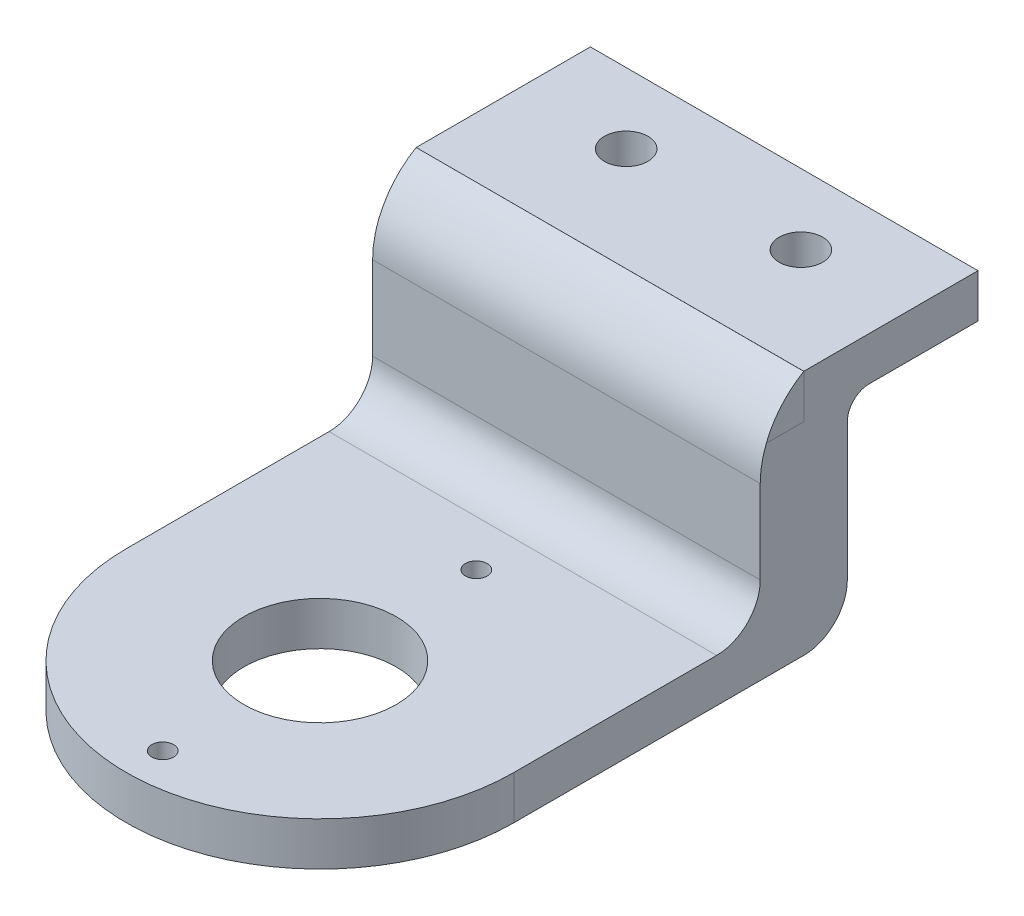
ISO-10303-21;
HEADER;
FILE_DESCRIPTION(('STEP AP214'),'2;1');
FILE_NAME('part.step','',(''),(''),'','','');
FILE_SCHEMA(('AUTOMOTIVE_DESIGN { 1 0 10303 214 1 1 1 1 }'));
ENDSEC;
DATA;
#1=APPLICATION_CONTEXT('core data for automotive mechanical design processes');
#2=APPLICATION_PROTOCOL_DEFINITION('international standard','automotive_design',2000,#1);
#3=PRODUCT_CONTEXT('',#1,'mechanical');
#4=PRODUCT('Part','Part','',(#3));
#5=PRODUCT_RELATED_PRODUCT_CATEGORY('part','',(#4));
#6=PRODUCT_DEFINITION_FORMATION('','',#4);
#7=PRODUCT_DEFINITION_CONTEXT('part definition',#1,'design');
#8=PRODUCT_DEFINITION('design','',#6,#7);
#9=PRODUCT_DEFINITION_SHAPE('','',#8);
#10=(LENGTH_UNIT() NAMED_UNIT(*) SI_UNIT(.MILLI.,.METRE.));
#11=(NAMED_UNIT(*) PLANE_ANGLE_UNIT() SI_UNIT($,.RADIAN.));
#12=(NAMED_UNIT(*) SI_UNIT($,.STERADIAN.) SOLID_ANGLE_UNIT());
#13=UNCERTAINTY_MEASURE_WITH_UNIT(LENGTH_MEASURE(1.E-05),#10,'distance_accuracy_value','');
#14=(GEOMETRIC_REPRESENTATION_CONTEXT(3) GLOBAL_UNCERTAINTY_ASSIGNED_CONTEXT((#13)) GLOBAL_UNIT_ASSIGNED_CONTEXT((#10,
#11,#12)) REPRESENTATION_CONTEXT('',''));
#15=CARTESIAN_POINT('',(0.,0.,0.));
#16=DIRECTION('',(0.,0.,1.));
#17=DIRECTION('',(1.,0.,0.));
#18=AXIS2_PLACEMENT_3D('',#15,#16,#17);
#19=CARTESIAN_POINT('',(8.925,-14.,-26.4139671971717));
#20=DIRECTION('',(0.,0.,1.));
#21=DIRECTION('',(1.,0.,0.));
#22=AXIS2_PLACEMENT_3D('',#19,#20,#21);
#23=PLANE('',#22);
#24=DIRECTION('',(-0.000175443126578921,-0.999999984609855,0.));
#25=VECTOR('',#24,1.);
#26=CARTESIAN_POINT('',(-8.87464911374685,-14.0000000307803,-26.4139671971717));
#27=LINE('',#26,#25);
#28=CARTESIAN_POINT('',(-8.87464911374685,-14.0000000307803,-26.4139671971717));
#29=VERTEX_POINT('',#28);
#30=CARTESIAN_POINT('',(-8.875,-16.,-26.4139671971717));
#31=VERTEX_POINT('',#30);
#32=EDGE_CURVE('E138',#29,#31,#27,.T.);
#33=ORIENTED_EDGE('',*,*,#32,.F.);
#34=DIRECTION('',(-1.,0.,0.));
#35=VECTOR('',#34,1.);
#36=CARTESIAN_POINT('',(8.925,-14.,-26.4139671971717));
#37=LINE('',#36,#35);
#38=CARTESIAN_POINT('',(-8.875,-14.,-26.4139671971717));
#39=VERTEX_POINT('',#38);
#40=EDGE_CURVE('E317',#29,#39,#37,.T.);
#41=ORIENTED_EDGE('',*,*,#40,.T.);
#42=DIRECTION('',(0.,-1.,0.));
#43=VECTOR('',#42,1.);
#44=CARTESIAN_POINT('',(-8.875,-14.,-26.4139671971717));
#45=LINE('',#44,#43);
#46=EDGE_CURVE('E326',#39,#31,#45,.T.);
#47=ORIENTED_EDGE('',*,*,#46,.T.);
#48=EDGE_LOOP('',(#33,#41,#47));
#49=FACE_BOUND('',#48,.T.);
#50=ADVANCED_FACE('F17',(#49),#23,.T.);
#51=CARTESIAN_POINT('',(0.024999999999999,-23.3,-13.1));
#52=DIRECTION('',(0.,1.,0.));
#53=DIRECTION('',(0.,0.,1.));
#54=AXIS2_PLACEMENT_3D('',#51,#52,#53);
#55=PLANE('',#54);
#56=CARTESIAN_POINT('',(0.,-23.3,-20.3));
#57=DIRECTION('',(0.,1.,0.));
#58=DIRECTION('',(0.,0.,1.));
#59=AXIS2_PLACEMENT_3D('',#56,#57,#58);
#60=CIRCLE('',#59,0.5);
#61=CARTESIAN_POINT('',(0.,-23.3,-19.8));
#62=VERTEX_POINT('',#61);
#63=EDGE_CURVE('E21',#62,#62,#60,.T.);
#64=ORIENTED_EDGE('',*,*,#63,.F.);
#65=EDGE_LOOP('',(#64));
#66=FACE_BOUND('',#65,.T.);
#67=CARTESIAN_POINT('',(0.,-23.3,-5.9));
#68=DIRECTION('',(0.,1.,0.));
#69=DIRECTION('',(0.,0.,1.));
#70=AXIS2_PLACEMENT_3D('',#67,#68,#69);
#71=CIRCLE('',#70,0.5);
#72=CARTESIAN_POINT('',(0.,-23.3,-5.4));
#73=VERTEX_POINT('',#72);
#74=EDGE_CURVE('E210',#73,#73,#71,.T.);
#75=ORIENTED_EDGE('',*,*,#74,.F.);
#76=EDGE_LOOP('',(#75));
#77=FACE_BOUND('',#76,.T.);
#78=CARTESIAN_POINT('',(0.024999999999999,-23.3,-13.1));
#79=DIRECTION('',(0.,-1.,0.));
#80=DIRECTION('',(1.,0.,0.));
#81=AXIS2_PLACEMENT_3D('',#78,#79,#80);
#82=CIRCLE('',#81,3.5);
#83=CARTESIAN_POINT('',(3.525,-23.3,-13.1));
#84=VERTEX_POINT('',#83);
#85=EDGE_CURVE('E147',#84,#84,#82,.T.);
#86=ORIENTED_EDGE('',*,*,#85,.T.);
#87=EDGE_LOOP('',(#86));
#88=FACE_BOUND('',#87,.T.);
#89=DIRECTION('',(0.,0.,-1.));
#90=VECTOR('',#89,1.);
#91=CARTESIAN_POINT('',(8.925,-23.3,-13.1));
#92=LINE('',#91,#90);
#93=CARTESIAN_POINT('',(8.925,-23.3,-13.1));
#94=VERTEX_POINT('',#93);
#95=CARTESIAN_POINT('',(8.925,-23.3,-22.4139671971717));
#96=VERTEX_POINT('',#95);
#97=EDGE_CURVE('E258',#94,#96,#92,.T.);
#98=ORIENTED_EDGE('',*,*,#97,.T.);
#99=DIRECTION('',(-1.,0.,0.));
#100=VECTOR('',#99,1.);
#101=CARTESIAN_POINT('',(0.024999999999999,-23.3,-22.4139671971717));
#102=LINE('',#101,#100);
#103=CARTESIAN_POINT('',(-8.875,-23.3,-22.4139671971717));
#104=VERTEX_POINT('',#103);
#105=EDGE_CURVE('E177',#96,#104,#102,.T.);
#106=ORIENTED_EDGE('',*,*,#105,.T.);
#107=DIRECTION('',(0.,0.,1.));
#108=VECTOR('',#107,1.);
#109=CARTESIAN_POINT('',(-8.875,-23.3,-28.4139671971717));
#110=LINE('',#109,#108);
#111=CARTESIAN_POINT('',(-8.875,-23.3,-13.1));
#112=VERTEX_POINT('',#111);
#113=EDGE_CURVE('E251',#104,#112,#110,.T.);
#114=ORIENTED_EDGE('',*,*,#113,.T.);
#115=CARTESIAN_POINT('',(0.024999999999999,-23.3,-13.1));
#116=DIRECTION('',(0.,1.,0.));
#117=DIRECTION('',(1.,0.,0.));
#118=AXIS2_PLACEMENT_3D('',#115,#116,#117);
#119=CIRCLE('',#118,8.9);
#120=EDGE_CURVE('E269',#112,#94,#119,.T.);
#121=ORIENTED_EDGE('',*,*,#120,.T.);
#122=EDGE_LOOP('',(#98,#106,#114,#121));
#123=FACE_BOUND('',#122,.T.);
#124=ADVANCED_FACE('F364',(#66,#77,#88,#123),#55,.T.);
#125=CARTESIAN_POINT('',(0.,-14.,0.));
#126=DIRECTION('',(0.,-1.,0.));
#127=DIRECTION('',(0.,0.,-1.));
#128=AXIS2_PLACEMENT_3D('',#125,#126,#127);
#129=PLANE('',#128);
#130=CARTESIAN_POINT('',(-4.,-14.,-31.1818617364617));
#131=DIRECTION('',(0.,-1.,0.));
#132=DIRECTION('',(-1.,0.,0.));
#133=AXIS2_PLACEMENT_3D('',#130,#131,#132);
#134=CIRCLE('',#133,1.);
#135=CARTESIAN_POINT('',(-5.,-14.,-31.1818617364617));
#136=VERTEX_POINT('',#135);
#137=EDGE_CURVE('E282',#136,#136,#134,.T.);
#138=ORIENTED_EDGE('',*,*,#137,.T.);
#139=EDGE_LOOP('',(#138));
#140=FACE_BOUND('',#139,.T.);
#141=DIRECTION('',(0.,0.,1.));
#142=VECTOR('',#141,1.);
#143=CARTESIAN_POINT('',(8.925,-14.,-28.4139671971717));
#144=LINE('',#143,#142);
#145=CARTESIAN_POINT('',(8.925,-14.,-34.4139671971717));
#146=VERTEX_POINT('',#145);
#147=CARTESIAN_POINT('',(8.925,-14.,-26.4139671971717));
#148=VERTEX_POINT('',#147);
#149=EDGE_CURVE('E313',#146,#148,#144,.T.);
#150=ORIENTED_EDGE('',*,*,#149,.F.);
#151=DIRECTION('',(-1.,0.,0.));
#152=VECTOR('',#151,1.);
#153=CARTESIAN_POINT('',(8.925,-14.,-34.4139671971717));
#154=LINE('',#153,#152);
#155=CARTESIAN_POINT('',(-8.875,-14.,-34.4139671971717));
#156=VERTEX_POINT('',#155);
#157=EDGE_CURVE('E291',#146,#156,#154,.T.);
#158=ORIENTED_EDGE('',*,*,#157,.T.);
#159=DIRECTION('',(0.,0.,-1.));
#160=VECTOR('',#159,1.);
#161=CARTESIAN_POINT('',(-8.875,-14.,-26.4139671971717));
#162=LINE('',#161,#160);
#163=EDGE_CURVE('E322',#39,#156,#162,.T.);
#164=ORIENTED_EDGE('',*,*,#163,.F.);
#165=ORIENTED_EDGE('',*,*,#40,.F.);
#166=EDGE_CURVE('E318',#148,#29,#37,.T.);
#167=ORIENTED_EDGE('',*,*,#166,.F.);
#168=EDGE_LOOP('',(#150,#158,#164,#165,#167));
#169=FACE_BOUND('',#168,.T.);
#170=CARTESIAN_POINT('',(4.025,-14.,-31.1818617364574));
#171=DIRECTION('',(0.,1.,0.));
#172=DIRECTION('',(-1.,0.,0.));
#173=AXIS2_PLACEMENT_3D('',#170,#171,#172);
#174=CIRCLE('',#173,1.);
#175=CARTESIAN_POINT('',(3.025,-14.,-31.1818617364574));
#176=VERTEX_POINT('',#175);
#177=EDGE_CURVE('E283',#176,#176,#174,.T.);
#178=ORIENTED_EDGE('',*,*,#177,.F.);
#179=EDGE_LOOP('',(#178));
#180=FACE_BOUND('',#179,.T.);
#181=ADVANCED_FACE('F354',(#140,#169,#180),#129,.F.);
#182=CARTESIAN_POINT('',(-8.875,-16.,-34.4139671971717));
#183=DIRECTION('',(-0.000175443126578965,-0.999999984609855,0.));
#184=DIRECTION('',(0.999999984609855,-0.000175443126578965,0.));
#185=AXIS2_PLACEMENT_3D('',#182,#183,#184);
#186=PLANE('',#185);
#187=CARTESIAN_POINT('',(-4.,-16.0008552852553,-31.1818617364617));
#188=DIRECTION('',(-0.000175443126578965,-0.999999984609855,0.));
#189=DIRECTION('',(-0.999999984609855,0.000175443126578965,0.));
#190=AXIS2_PLACEMENT_3D('',#187,#188,#189);
#191=ELLIPSE('',#190,1.00000001539015,1.);
#192=CARTESIAN_POINT('',(-5.,-16.000679842126,-31.1818617364617));
#193=VERTEX_POINT('',#192);
#194=EDGE_CURVE('E287',#193,#193,#191,.F.);
#195=ORIENTED_EDGE('',*,*,#194,.T.);
#196=EDGE_LOOP('',(#195));
#197=FACE_BOUND('',#196,.T.);
#198=DIRECTION('',(0.,0.,1.));
#199=VECTOR('',#198,1.);
#200=CARTESIAN_POINT('',(8.925,-16.0031228877011,-34.4139671971717));
#201=LINE('',#200,#199);
#202=CARTESIAN_POINT('',(8.925,-16.0031228877011,-34.4139671971717));
#203=VERTEX_POINT('',#202);
#204=CARTESIAN_POINT('',(8.925,-16.0031228877011,-29.4139671971717));
#205=VERTEX_POINT('',#204);
#206=EDGE_CURVE('E307',#203,#205,#201,.T.);
#207=ORIENTED_EDGE('',*,*,#206,.T.);
#208=DIRECTION('',(0.999999984609855,-0.000175443126578965,0.));
#209=VECTOR('',#208,1.);
#210=CARTESIAN_POINT('',(-8.875,-16.,-29.4139671971717));
#211=LINE('',#210,#209);
#212=CARTESIAN_POINT('',(-8.875,-16.,-29.4139671971717));
#213=VERTEX_POINT('',#212);
#214=EDGE_CURVE('E41',#205,#213,#211,.F.);
#215=ORIENTED_EDGE('',*,*,#214,.T.);
#216=DIRECTION('',(0.,0.,1.));
#217=VECTOR('',#216,1.);
#218=CARTESIAN_POINT('',(-8.875,-16.,-34.4139671971717));
#219=LINE('',#218,#217);
#220=CARTESIAN_POINT('',(-8.875,-16.,-34.4139671971717));
#221=VERTEX_POINT('',#220);
#222=EDGE_CURVE('E310',#221,#213,#219,.T.);
#223=ORIENTED_EDGE('',*,*,#222,.F.);
#224=DIRECTION('',(0.999999984609855,-0.000175443126578965,0.));
#225=VECTOR('',#224,1.);
#226=CARTESIAN_POINT('',(-8.875,-16.,-34.4139671971717));
#227=LINE('',#226,#225);
#228=EDGE_CURVE('E299',#221,#203,#227,.T.);
#229=ORIENTED_EDGE('',*,*,#228,.T.);
#230=EDGE_LOOP('',(#207,#215,#223,#229));
#231=FACE_BOUND('',#230,.T.);
#232=CARTESIAN_POINT('',(4.025,-16.0022632163677,-31.1818617364574));
#233=DIRECTION('',(-0.000175443126578965,-0.999999984609855,0.));
#234=DIRECTION('',(-0.999999984609855,0.000175443126578965,0.));
#235=AXIS2_PLACEMENT_3D('',#232,#233,#234);
#236=ELLIPSE('',#235,1.00000001539015,1.);
#237=CARTESIAN_POINT('',(3.025,-16.0020877732384,-31.1818617364574));
#238=VERTEX_POINT('',#237);
#239=EDGE_CURVE('E167',#238,#238,#236,.T.);
#240=ORIENTED_EDGE('',*,*,#239,.F.);
#241=EDGE_LOOP('',(#240));
#242=FACE_BOUND('',#241,.T.);
#243=ADVANCED_FACE('F351',(#197,#231,#242),#186,.T.);
#244=CARTESIAN_POINT('',(-8.875,-14.,-28.4139671971717));
#245=DIRECTION('',(0.,0.,-1.));
#246=DIRECTION('',(-1.,0.,0.));
#247=AXIS2_PLACEMENT_3D('',#244,#245,#246);
#248=PLANE('',#247);
#249=DIRECTION('',(0.,-1.,0.));
#250=VECTOR('',#249,1.);
#251=CARTESIAN_POINT('',(-8.875,-14.,-28.4139671971717));
#252=LINE('',#251,#250);
#253=CARTESIAN_POINT('',(-8.875,-23.3,-28.4139671971717));
#254=VERTEX_POINT('',#253);
#255=CARTESIAN_POINT('',(-8.875,-17.0000000153901,-28.4139671971717));
#256=VERTEX_POINT('',#255);
#257=EDGE_CURVE('E325',#254,#256,#252,.F.);
#258=ORIENTED_EDGE('',*,*,#257,.T.);
#259=DIRECTION('',(0.999999984609855,-0.000175443126578965,0.));
#260=VECTOR('',#259,1.);
#261=CARTESIAN_POINT('',(8.92482455687342,-17.003122872311,-28.4139671971717));
#262=LINE('',#261,#260);
#263=CARTESIAN_POINT('',(8.925,-17.0031229030913,-28.4139671971717));
#264=VERTEX_POINT('',#263);
#265=EDGE_CURVE('E203',#256,#264,#262,.T.);
#266=ORIENTED_EDGE('',*,*,#265,.T.);
#267=DIRECTION('',(0.,-1.,0.));
#268=VECTOR('',#267,1.);
#269=CARTESIAN_POINT('',(8.925,-14.,-28.4139671971717));
#270=LINE('',#269,#268);
#271=CARTESIAN_POINT('',(8.925,-23.3,-28.4139671971717));
#272=VERTEX_POINT('',#271);
#273=EDGE_CURVE('E165',#272,#264,#270,.F.);
#274=ORIENTED_EDGE('',*,*,#273,.F.);
#275=DIRECTION('',(-1.,0.,0.));
#276=VECTOR('',#275,1.);
#277=CARTESIAN_POINT('',(-8.875,-23.3,-28.4139671971717));
#278=LINE('',#277,#276);
#279=EDGE_CURVE('E190',#272,#254,#278,.T.);
#280=ORIENTED_EDGE('',*,*,#279,.T.);
#281=EDGE_LOOP('',(#258,#266,#274,#280));
#282=FACE_BOUND('',#281,.T.);
#283=ADVANCED_FACE('F353',(#282),#248,.T.);
#284=CARTESIAN_POINT('',(8.925,-14.,-28.4139671971717));
#285=DIRECTION('',(1.,0.,0.));
#286=DIRECTION('',(0.,0.,-1.));
#287=AXIS2_PLACEMENT_3D('',#284,#285,#286);
#288=PLANE('',#287);
#289=DIRECTION('',(0.,0.,-1.));
#290=VECTOR('',#289,1.);
#291=CARTESIAN_POINT('',(8.925,-25.3,-13.1));
#292=LINE('',#291,#290);
#293=CARTESIAN_POINT('',(8.925,-25.3,-13.1));
#294=VERTEX_POINT('',#293);
#295=CARTESIAN_POINT('',(8.925,-25.3,-26.4139671971717));
#296=VERTEX_POINT('',#295);
#297=EDGE_CURVE('E262',#294,#296,#292,.T.);
#298=ORIENTED_EDGE('',*,*,#297,.T.);
#299=CARTESIAN_POINT('',(8.925,-23.3,-26.4139671971717));
#300=DIRECTION('',(1.,0.,0.));
#301=DIRECTION('',(0.,0.,-1.));
#302=AXIS2_PLACEMENT_3D('',#299,#300,#301);
#303=CIRCLE('',#302,2.);
#304=EDGE_CURVE('E200',#296,#272,#303,.T.);
#305=ORIENTED_EDGE('',*,*,#304,.T.);
#306=ORIENTED_EDGE('',*,*,#273,.T.);
#307=CARTESIAN_POINT('',(8.925,-17.0031229030913,-29.4139671971717));
#308=DIRECTION('',(1.,0.,0.));
#309=DIRECTION('',(0.,1.,0.));
#310=AXIS2_PLACEMENT_3D('',#307,#308,#309);
#311=ELLIPSE('',#310,1.00000001539015,1.);
#312=EDGE_CURVE('E27',#264,#205,#311,.F.);
#313=ORIENTED_EDGE('',*,*,#312,.T.);
#314=ORIENTED_EDGE('',*,*,#206,.F.);
#315=DIRECTION('',(0.,1.,0.));
#316=VECTOR('',#315,1.);
#317=CARTESIAN_POINT('',(8.925,-16.0031228877011,-34.4139671971717));
#318=LINE('',#317,#316);
#319=EDGE_CURVE('E303',#203,#146,#318,.T.);
#320=ORIENTED_EDGE('',*,*,#319,.T.);
#321=ORIENTED_EDGE('',*,*,#149,.T.);
#322=DIRECTION('',(0.,-1.,0.));
#323=VECTOR('',#322,1.);
#324=CARTESIAN_POINT('',(8.925,-14.,-26.4139671971717));
#325=LINE('',#324,#323);
#326=CARTESIAN_POINT('',(8.925,-14.0031228569209,-26.4139671971717));
#327=VERTEX_POINT('',#326);
#328=EDGE_CURVE('E330',#148,#327,#325,.T.);
#329=ORIENTED_EDGE('',*,*,#328,.T.);
#330=CARTESIAN_POINT('',(8.925,-16.0031228877011,-26.4139671971717));
#331=VERTEX_POINT('',#330);
#332=EDGE_CURVE('E142',#327,#331,#325,.T.);
#333=ORIENTED_EDGE('',*,*,#332,.T.);
#334=DIRECTION('',(0.,0.,-1.));
#335=VECTOR('',#334,1.);
#336=CARTESIAN_POINT('',(8.925,-16.0031228877011,-24.4139671971717));
#337=LINE('',#336,#335);
#338=CARTESIAN_POINT('',(8.925,-16.0031228877011,-24.6915477607633));
#339=VERTEX_POINT('',#338);
#340=EDGE_CURVE('E133',#339,#331,#337,.T.);
#341=ORIENTED_EDGE('',*,*,#340,.F.);
#342=CARTESIAN_POINT('',(8.925,-17.4672245253717,-28.4139671971717));
#343=DIRECTION('',(1.,0.,0.));
#344=DIRECTION('',(0.,-1.,-2.22194794302517E-12));
#345=AXIS2_PLACEMENT_3D('',#342,#343,#344);
#346=ELLIPSE('',#345,4.00000006156058,4.);
#347=CARTESIAN_POINT('',(8.925,-17.4672245253717,-24.4139671971717));
#348=VERTEX_POINT('',#347);
#349=EDGE_CURVE('E154',#339,#348,#346,.T.);
#350=ORIENTED_EDGE('',*,*,#349,.T.);
#351=DIRECTION('',(0.,-1.,0.));
#352=VECTOR('',#351,1.);
#353=CARTESIAN_POINT('',(8.925,-16.0031228877011,-24.4139671971717));
#354=LINE('',#353,#352);
#355=CARTESIAN_POINT('',(8.925,-21.3,-24.4139671971717));
#356=VERTEX_POINT('',#355);
#357=EDGE_CURVE('E240',#348,#356,#354,.T.);
#358=ORIENTED_EDGE('',*,*,#357,.T.);
#359=CARTESIAN_POINT('',(8.925,-21.3,-22.4139671971717));
#360=DIRECTION('',(1.,0.,0.));
#361=DIRECTION('',(0.,0.,-1.));
#362=AXIS2_PLACEMENT_3D('',#359,#360,#361);
#363=CIRCLE('',#362,2.);
#364=EDGE_CURVE('E187',#356,#96,#363,.F.);
#365=ORIENTED_EDGE('',*,*,#364,.T.);
#366=ORIENTED_EDGE('',*,*,#97,.F.);
#367=DIRECTION('',(0.,1.,0.));
#368=VECTOR('',#367,1.);
#369=CARTESIAN_POINT('',(8.925,-25.3,-13.1));
#370=LINE('',#369,#368);
#371=EDGE_CURVE('E266',#294,#94,#370,.T.);
#372=ORIENTED_EDGE('',*,*,#371,.F.);
#373=EDGE_LOOP('',(#298,#305,#306,#313,#314,#320,#321,#329,#333,#341,#350,#358,#365,#366,#372));
#374=FACE_BOUND('',#373,.T.);
#375=ADVANCED_FACE('F361',(#374),#288,.T.);
#376=DIRECTION('',(-0.999999984609855,0.000175443126578965,0.));
#377=VECTOR('',#376,1.);
#378=CARTESIAN_POINT('',(8.92535088625316,-14.0031229184815,-26.4139671971717));
#379=LINE('',#378,#377);
#380=EDGE_CURVE('E149',#327,#29,#379,.T.);
#381=ORIENTED_EDGE('',*,*,#380,.F.);
#382=ORIENTED_EDGE('',*,*,#328,.F.);
#383=ORIENTED_EDGE('',*,*,#166,.T.);
#384=EDGE_LOOP('',(#381,#382,#383));
#385=FACE_BOUND('',#384,.T.);
#386=ADVANCED_FACE('F371',(#385),#23,.T.);
#387=CARTESIAN_POINT('',(-8.875,-14.,-26.4139671971717));
#388=DIRECTION('',(-1.,0.,0.));
#389=DIRECTION('',(0.,0.,1.));
#390=AXIS2_PLACEMENT_3D('',#387,#388,#389);
#391=PLANE('',#390);
#392=ORIENTED_EDGE('',*,*,#257,.F.);
#393=CARTESIAN_POINT('',(-8.875,-23.3,-26.4139671971717));
#394=DIRECTION('',(-1.,0.,0.));
#395=DIRECTION('',(0.,0.,1.));
#396=AXIS2_PLACEMENT_3D('',#393,#394,#395);
#397=CIRCLE('',#396,2.);
#398=CARTESIAN_POINT('',(-8.875,-25.3,-26.4139671971717));
#399=VERTEX_POINT('',#398);
#400=EDGE_CURVE('E194',#254,#399,#397,.T.);
#401=ORIENTED_EDGE('',*,*,#400,.T.);
#402=DIRECTION('',(0.,0.,1.));
#403=VECTOR('',#402,1.);
#404=CARTESIAN_POINT('',(-8.875,-25.3,-28.4139671971717));
#405=LINE('',#404,#403);
#406=CARTESIAN_POINT('',(-8.875,-25.3,-13.1));
#407=VERTEX_POINT('',#406);
#408=EDGE_CURVE('E254',#399,#407,#405,.T.);
#409=ORIENTED_EDGE('',*,*,#408,.T.);
#410=DIRECTION('',(0.,1.,0.));
#411=VECTOR('',#410,1.);
#412=CARTESIAN_POINT('',(-8.875,-25.3,-13.1));
#413=LINE('',#412,#411);
#414=EDGE_CURVE('E278',#407,#112,#413,.T.);
#415=ORIENTED_EDGE('',*,*,#414,.T.);
#416=ORIENTED_EDGE('',*,*,#113,.F.);
#417=CARTESIAN_POINT('',(-8.875,-21.3,-22.4139671971717));
#418=DIRECTION('',(-1.,0.,0.));
#419=DIRECTION('',(0.,0.,1.));
#420=AXIS2_PLACEMENT_3D('',#417,#418,#419);
#421=CIRCLE('',#420,2.);
#422=CARTESIAN_POINT('',(-8.875,-21.3,-24.4139671971717));
#423=VERTEX_POINT('',#422);
#424=EDGE_CURVE('E184',#104,#423,#421,.F.);
#425=ORIENTED_EDGE('',*,*,#424,.T.);
#426=DIRECTION('',(0.,1.,0.));
#427=VECTOR('',#426,1.);
#428=CARTESIAN_POINT('',(-8.875,-23.3,-24.4139671971717));
#429=LINE('',#428,#427);
#430=CARTESIAN_POINT('',(-8.875,-17.4641016376705,-24.4139671971717));
#431=VERTEX_POINT('',#430);
#432=EDGE_CURVE('E245',#423,#431,#429,.T.);
#433=ORIENTED_EDGE('',*,*,#432,.T.);
#434=CARTESIAN_POINT('',(-8.875,-17.4641016376705,-28.4139671971717));
#435=DIRECTION('',(-1.,0.,0.));
#436=DIRECTION('',(0.,-1.,-2.22194794302517E-12));
#437=AXIS2_PLACEMENT_3D('',#434,#435,#436);
#438=ELLIPSE('',#437,4.00000006156058,4.);
#439=CARTESIAN_POINT('',(-8.875,-16.,-24.6915477607633));
#440=VERTEX_POINT('',#439);
#441=EDGE_CURVE('E172',#431,#440,#438,.T.);
#442=ORIENTED_EDGE('',*,*,#441,.T.);
#443=DIRECTION('',(0.,0.,-1.));
#444=VECTOR('',#443,1.);
#445=CARTESIAN_POINT('',(-8.875,-16.,-24.4139671971717));
#446=LINE('',#445,#444);
#447=EDGE_CURVE('E248',#440,#31,#446,.T.);
#448=ORIENTED_EDGE('',*,*,#447,.T.);
#449=ORIENTED_EDGE('',*,*,#46,.F.);
#450=ORIENTED_EDGE('',*,*,#163,.T.);
#451=DIRECTION('',(0.,-1.,0.));
#452=VECTOR('',#451,1.);
#453=CARTESIAN_POINT('',(-8.875,-14.,-34.4139671971717));
#454=LINE('',#453,#452);
#455=EDGE_CURVE('E295',#156,#221,#454,.T.);
#456=ORIENTED_EDGE('',*,*,#455,.T.);
#457=ORIENTED_EDGE('',*,*,#222,.T.);
#458=CARTESIAN_POINT('',(-8.875,-17.0000000153901,-29.4139671971717));
#459=DIRECTION('',(-1.,0.,0.));
#460=DIRECTION('',(0.,1.,0.));
#461=AXIS2_PLACEMENT_3D('',#458,#459,#460);
#462=ELLIPSE('',#461,1.00000001539015,1.);
#463=EDGE_CURVE('E11',#213,#256,#462,.F.);
#464=ORIENTED_EDGE('',*,*,#463,.T.);
#465=EDGE_LOOP('',(#392,#401,#409,#415,#416,#425,#433,#442,#448,#449,#450,#456,#457,#464));
#466=FACE_BOUND('',#465,.T.);
#467=ADVANCED_FACE('F381',(#466),#391,.T.);
#468=CARTESIAN_POINT('',(0.,0.,-34.4139671971717));
#469=DIRECTION('',(0.,0.,1.));
#470=DIRECTION('',(1.,0.,0.));
#471=AXIS2_PLACEMENT_3D('',#468,#469,#470);
#472=PLANE('',#471);
#473=ORIENTED_EDGE('',*,*,#157,.F.);
#474=ORIENTED_EDGE('',*,*,#319,.F.);
#475=ORIENTED_EDGE('',*,*,#228,.F.);
#476=ORIENTED_EDGE('',*,*,#455,.F.);
#477=EDGE_LOOP('',(#473,#474,#475,#476));
#478=FACE_BOUND('',#477,.T.);
#479=ADVANCED_FACE('F387',(#478),#472,.F.);
#480=CARTESIAN_POINT('',(-4.,-18.,-31.1818617364617));
#481=DIRECTION('',(0.,1.,0.));
#482=DIRECTION('',(0.,0.,1.));
#483=AXIS2_PLACEMENT_3D('',#480,#481,#482);
#484=CYLINDRICAL_SURFACE('',#483,1.);
#485=ORIENTED_EDGE('',*,*,#194,.F.);
#486=EDGE_LOOP('',(#485));
#487=FACE_BOUND('',#486,.T.);
#488=ORIENTED_EDGE('',*,*,#137,.F.);
#489=EDGE_LOOP('',(#488));
#490=FACE_BOUND('',#489,.T.);
#491=ADVANCED_FACE('F469',(#487,#490),#484,.F.);
#492=CARTESIAN_POINT('',(4.025,-18.,-31.1818617364574));
#493=DIRECTION('',(0.,1.,0.));
#494=DIRECTION('',(0.,0.,1.));
#495=AXIS2_PLACEMENT_3D('',#492,#493,#494);
#496=CYLINDRICAL_SURFACE('',#495,1.);
#497=ORIENTED_EDGE('',*,*,#239,.T.);
#498=EDGE_LOOP('',(#497));
#499=FACE_BOUND('',#498,.T.);
#500=ORIENTED_EDGE('',*,*,#177,.T.);
#501=EDGE_LOOP('',(#500));
#502=FACE_BOUND('',#501,.T.);
#503=ADVANCED_FACE('F348',(#499,#502),#496,.F.);
#504=CARTESIAN_POINT('',(0.024999999999999,-25.3,-13.1));
#505=DIRECTION('',(0.,1.,0.));
#506=DIRECTION('',(0.,0.,1.));
#507=AXIS2_PLACEMENT_3D('',#504,#505,#506);
#508=CYLINDRICAL_SURFACE('',#507,8.9);
#509=ORIENTED_EDGE('',*,*,#120,.F.);
#510=ORIENTED_EDGE('',*,*,#414,.F.);
#511=CARTESIAN_POINT('',(0.024999999999999,-25.3,-13.1));
#512=DIRECTION('',(0.,1.,0.));
#513=DIRECTION('',(1.,0.,0.));
#514=AXIS2_PLACEMENT_3D('',#511,#512,#513);
#515=CIRCLE('',#514,8.9);
#516=EDGE_CURVE('E257',#407,#294,#515,.T.);
#517=ORIENTED_EDGE('',*,*,#516,.T.);
#518=ORIENTED_EDGE('',*,*,#371,.T.);
#519=EDGE_LOOP('',(#509,#510,#517,#518));
#520=FACE_BOUND('',#519,.T.);
#521=ADVANCED_FACE('F420',(#520),#508,.T.);
#522=CARTESIAN_POINT('',(0.024999999999999,-25.3,-13.1));
#523=DIRECTION('',(0.,1.,0.));
#524=DIRECTION('',(0.,0.,1.));
#525=AXIS2_PLACEMENT_3D('',#522,#523,#524);
#526=PLANE('',#525);
#527=CARTESIAN_POINT('',(0.,-25.3,-20.3));
#528=DIRECTION('',(0.,-1.,0.));
#529=DIRECTION('',(-1.,0.,0.));
#530=AXIS2_PLACEMENT_3D('',#527,#528,#529);
#531=CIRCLE('',#530,0.5);
#532=CARTESIAN_POINT('',(-0.499999999999965,-25.3,-20.3));
#533=VERTEX_POINT('',#532);
#534=EDGE_CURVE('E213',#533,#533,#531,.T.);
#535=ORIENTED_EDGE('',*,*,#534,.F.);
#536=EDGE_LOOP('',(#535));
#537=FACE_BOUND('',#536,.T.);
#538=CARTESIAN_POINT('',(0.,-25.3,-5.9));
#539=DIRECTION('',(0.,-1.,0.));
#540=DIRECTION('',(-1.,0.,0.));
#541=AXIS2_PLACEMENT_3D('',#538,#539,#540);
#542=CIRCLE('',#541,0.5);
#543=CARTESIAN_POINT('',(-0.499999999999963,-25.3,-5.9));
#544=VERTEX_POINT('',#543);
#545=EDGE_CURVE('E223',#544,#544,#542,.T.);
#546=ORIENTED_EDGE('',*,*,#545,.F.);
#547=EDGE_LOOP('',(#546));
#548=FACE_BOUND('',#547,.T.);
#549=CARTESIAN_POINT('',(0.024999999999999,-25.3,-13.1));
#550=DIRECTION('',(0.,-1.,0.));
#551=DIRECTION('',(1.,0.,0.));
#552=AXIS2_PLACEMENT_3D('',#549,#550,#551);
#553=CIRCLE('',#552,3.5);
#554=CARTESIAN_POINT('',(3.525,-25.3,-13.1));
#555=VERTEX_POINT('',#554);
#556=EDGE_CURVE('E220',#555,#555,#553,.T.);
#557=ORIENTED_EDGE('',*,*,#556,.F.);
#558=EDGE_LOOP('',(#557));
#559=FACE_BOUND('',#558,.T.);
#560=ORIENTED_EDGE('',*,*,#408,.F.);
#561=DIRECTION('',(-1.,0.,0.));
#562=VECTOR('',#561,1.);
#563=CARTESIAN_POINT('',(8.925,-25.3,-26.4139671971717));
#564=LINE('',#563,#562);
#565=EDGE_CURVE('E197',#399,#296,#564,.F.);
#566=ORIENTED_EDGE('',*,*,#565,.T.);
#567=ORIENTED_EDGE('',*,*,#297,.F.);
#568=ORIENTED_EDGE('',*,*,#516,.F.);
#569=EDGE_LOOP('',(#560,#566,#567,#568));
#570=FACE_BOUND('',#569,.T.);
#571=ADVANCED_FACE('F461',(#537,#548,#559,#570),#526,.F.);
#572=CARTESIAN_POINT('',(0.,0.,-24.4139671971717));
#573=DIRECTION('',(0.,0.,-1.));
#574=DIRECTION('',(-1.,0.,0.));
#575=AXIS2_PLACEMENT_3D('',#572,#573,#574);
#576=PLANE('',#575);
#577=ORIENTED_EDGE('',*,*,#432,.F.);
#578=DIRECTION('',(-1.,0.,0.));
#579=VECTOR('',#578,1.);
#580=CARTESIAN_POINT('',(0.,-21.3,-24.4139671971717));
#581=LINE('',#580,#579);
#582=EDGE_CURVE('E181',#423,#356,#581,.F.);
#583=ORIENTED_EDGE('',*,*,#582,.T.);
#584=ORIENTED_EDGE('',*,*,#357,.F.);
#585=DIRECTION('',(0.999999984609855,-0.000175443126578965,0.));
#586=VECTOR('',#585,1.);
#587=CARTESIAN_POINT('',(-0.00306422972213065,-17.4656581578448,-24.4139671971717));
#588=LINE('',#587,#586);
#589=EDGE_CURVE('E162',#348,#431,#588,.F.);
#590=ORIENTED_EDGE('',*,*,#589,.T.);
#591=EDGE_LOOP('',(#577,#583,#584,#590));
#592=FACE_BOUND('',#591,.T.);
#593=ADVANCED_FACE('F408',(#592),#576,.F.);
#594=CARTESIAN_POINT('',(8.92535088625316,-14.0031229184815,-26.4139671971717));
#595=DIRECTION('',(0.,0.,1.));
#596=DIRECTION('',(1.,0.,0.));
#597=AXIS2_PLACEMENT_3D('',#594,#595,#596);
#598=PLANE('',#597);
#599=ORIENTED_EDGE('',*,*,#332,.F.);
#600=CARTESIAN_POINT('',(8.92535088625316,-14.0031229184815,-26.4139671971717));
#601=VERTEX_POINT('',#600);
#602=EDGE_CURVE('E139',#601,#327,#379,.T.);
#603=ORIENTED_EDGE('',*,*,#602,.F.);
#604=DIRECTION('',(-0.000175443126578921,-0.999999984609855,0.));
#605=VECTOR('',#604,1.);
#606=CARTESIAN_POINT('',(8.92535088625316,-14.0031229184815,-26.4139671971717));
#607=LINE('',#606,#605);
#608=EDGE_CURVE('E127',#601,#331,#607,.T.);
#609=ORIENTED_EDGE('',*,*,#608,.T.);
#610=EDGE_LOOP('',(#599,#603,#609));
#611=FACE_BOUND('',#610,.T.);
#612=ADVANCED_FACE('F141',(#611),#598,.F.);
#613=CARTESIAN_POINT('',(-8.87464911374685,-14.0000000307803,-26.4139671971717));
#614=DIRECTION('',(0.999999984609855,-0.000175443126578921,0.));
#615=DIRECTION('',(0.000175443126578921,0.999999984609855,0.));
#616=AXIS2_PLACEMENT_3D('',#613,#614,#615);
#617=PLANE('',#616);
#618=ORIENTED_EDGE('',*,*,#447,.F.);
#619=CARTESIAN_POINT('',(-8.875256866565,-17.464101592605,-28.4139671971717));
#620=DIRECTION('',(0.999999984609855,-0.000175443126578921,0.));
#621=DIRECTION('',(0.000175443126578921,0.999999984609855,0.));
#622=AXIS2_PLACEMENT_3D('',#619,#620,#621);
#623=CIRCLE('',#622,4.);
#624=EDGE_CURVE('E175',#440,#29,#623,.F.);
#625=ORIENTED_EDGE('',*,*,#624,.T.);
#626=ORIENTED_EDGE('',*,*,#32,.T.);
#627=EDGE_LOOP('',(#618,#625,#626));
#628=FACE_BOUND('',#627,.T.);
#629=ADVANCED_FACE('F401',(#628),#617,.F.);
#630=CARTESIAN_POINT('',(8.92535088625316,-14.0031229184815,-24.4139671971717));
#631=DIRECTION('',(-0.999999984609855,0.000175443126578921,0.));
#632=DIRECTION('',(-0.000175443126578921,-0.999999984609855,0.));
#633=AXIS2_PLACEMENT_3D('',#630,#631,#632);
#634=PLANE('',#633);
#635=ORIENTED_EDGE('',*,*,#608,.F.);
#636=CARTESIAN_POINT('',(8.92474313343501,-17.4672244803062,-28.4139671971717));
#637=DIRECTION('',(-0.999999984609855,0.000175443126578921,0.));
#638=DIRECTION('',(-0.000175443126578921,-0.999999984609855,0.));
#639=AXIS2_PLACEMENT_3D('',#636,#637,#638);
#640=CIRCLE('',#639,4.);
#641=EDGE_CURVE('E131',#601,#339,#640,.F.);
#642=ORIENTED_EDGE('',*,*,#641,.T.);
#643=ORIENTED_EDGE('',*,*,#340,.T.);
#644=EDGE_LOOP('',(#635,#642,#643));
#645=FACE_BOUND('',#644,.T.);
#646=ADVANCED_FACE('F129',(#645),#634,.F.);
#647=CARTESIAN_POINT('',(-0.00306422972214103,-17.4656581578448,-28.4139671971717));
#648=DIRECTION('',(0.999999984609855,-0.000175443126578965,0.));
#649=DIRECTION('',(0.000175443126578965,0.999999984609855,0.));
#650=AXIS2_PLACEMENT_3D('',#647,#648,#649);
#651=CYLINDRICAL_SURFACE('',#650,4.);
#652=ORIENTED_EDGE('',*,*,#441,.F.);
#653=ORIENTED_EDGE('',*,*,#589,.F.);
#654=ORIENTED_EDGE('',*,*,#349,.F.);
#655=ORIENTED_EDGE('',*,*,#641,.F.);
#656=ORIENTED_EDGE('',*,*,#602,.T.);
#657=ORIENTED_EDGE('',*,*,#380,.T.);
#658=ORIENTED_EDGE('',*,*,#624,.F.);
#659=EDGE_LOOP('',(#652,#653,#654,#655,#656,#657,#658));
#660=FACE_BOUND('',#659,.T.);
#661=ADVANCED_FACE('F152',(#660),#651,.T.);
#662=CARTESIAN_POINT('',(0.024999999999999,-21.3,-22.4139671971717));
#663=DIRECTION('',(-1.,0.,0.));
#664=DIRECTION('',(0.,0.,1.));
#665=AXIS2_PLACEMENT_3D('',#662,#663,#664);
#666=CYLINDRICAL_SURFACE('',#665,2.);
#667=ORIENTED_EDGE('',*,*,#364,.F.);
#668=ORIENTED_EDGE('',*,*,#582,.F.);
#669=ORIENTED_EDGE('',*,*,#424,.F.);
#670=ORIENTED_EDGE('',*,*,#105,.F.);
#671=EDGE_LOOP('',(#667,#668,#669,#670));
#672=FACE_BOUND('',#671,.T.);
#673=ADVANCED_FACE('F413',(#672),#666,.F.);
#674=CARTESIAN_POINT('',(-8.875,-23.3,-26.4139671971717));
#675=DIRECTION('',(1.,0.,0.));
#676=DIRECTION('',(0.,0.,-1.));
#677=AXIS2_PLACEMENT_3D('',#674,#675,#676);
#678=CYLINDRICAL_SURFACE('',#677,2.);
#679=ORIENTED_EDGE('',*,*,#304,.F.);
#680=ORIENTED_EDGE('',*,*,#565,.F.);
#681=ORIENTED_EDGE('',*,*,#400,.F.);
#682=ORIENTED_EDGE('',*,*,#279,.F.);
#683=EDGE_LOOP('',(#679,#680,#681,#682));
#684=FACE_BOUND('',#683,.T.);
#685=ADVANCED_FACE('F428',(#684),#678,.T.);
#686=CARTESIAN_POINT('',(-8.87552632937434,-16.9999999230492,-29.4139671971717));
#687=DIRECTION('',(-0.999999984609855,0.000175443126578965,0.));
#688=DIRECTION('',(-0.000175443126578965,-0.999999984609855,0.));
#689=AXIS2_PLACEMENT_3D('',#686,#687,#688);
#690=CYLINDRICAL_SURFACE('',#689,1.);
#691=ORIENTED_EDGE('',*,*,#463,.F.);
#692=ORIENTED_EDGE('',*,*,#214,.F.);
#693=ORIENTED_EDGE('',*,*,#312,.F.);
#694=ORIENTED_EDGE('',*,*,#265,.F.);
#695=EDGE_LOOP('',(#691,#692,#693,#694));
#696=FACE_BOUND('',#695,.T.);
#697=ADVANCED_FACE('F19',(#696),#690,.F.);
#698=CARTESIAN_POINT('',(0.024999999999999,-23.3,-13.1));
#699=DIRECTION('',(0.,-1.,0.));
#700=DIRECTION('',(0.,0.,-1.));
#701=AXIS2_PLACEMENT_3D('',#698,#699,#700);
#702=CYLINDRICAL_SURFACE('',#701,3.5);
#703=ORIENTED_EDGE('',*,*,#85,.F.);
#704=EDGE_LOOP('',(#703));
#705=FACE_BOUND('',#704,.T.);
#706=ORIENTED_EDGE('',*,*,#556,.T.);
#707=EDGE_LOOP('',(#706));
#708=FACE_BOUND('',#707,.T.);
#709=ADVANCED_FACE('F433',(#705,#708),#702,.F.);
#710=CARTESIAN_POINT('',(0.,-21.3,-5.9));
#711=DIRECTION('',(0.,-1.,0.));
#712=DIRECTION('',(0.,0.,-1.));
#713=AXIS2_PLACEMENT_3D('',#710,#711,#712);
#714=CYLINDRICAL_SURFACE('',#713,0.5);
#715=ORIENTED_EDGE('',*,*,#74,.T.);
#716=EDGE_LOOP('',(#715));
#717=FACE_BOUND('',#716,.T.);
#718=ORIENTED_EDGE('',*,*,#545,.T.);
#719=EDGE_LOOP('',(#718));
#720=FACE_BOUND('',#719,.T.);
#721=ADVANCED_FACE('F438',(#717,#720),#714,.F.);
#722=CARTESIAN_POINT('',(0.,-21.3,-20.3));
#723=DIRECTION('',(0.,-1.,0.));
#724=DIRECTION('',(0.,0.,-1.));
#725=AXIS2_PLACEMENT_3D('',#722,#723,#724);
#726=CYLINDRICAL_SURFACE('',#725,0.5);
#727=ORIENTED_EDGE('',*,*,#63,.T.);
#728=EDGE_LOOP('',(#727));
#729=FACE_BOUND('',#728,.T.);
#730=ORIENTED_EDGE('',*,*,#534,.T.);
#731=EDGE_LOOP('',(#730));
#732=FACE_BOUND('',#731,.T.);
#733=ADVANCED_FACE('F557',(#729,#732),#726,.F.);
#734=CLOSED_SHELL('',(#50,#124,#181,#243,#283,#375,#386,#467,#479,#491,#503,#521,#571,#593,#612,
#629,#646,#661,#673,#685,#697,#709,#721,#733));
#735=MANIFOLD_SOLID_BREP('B1',#734);
#736=ADVANCED_BREP_SHAPE_REPRESENTATION('',(#18,#735),#14);
#737=SHAPE_DEFINITION_REPRESENTATION(#9,#736);
ENDSEC;
END-ISO-10303-21;
